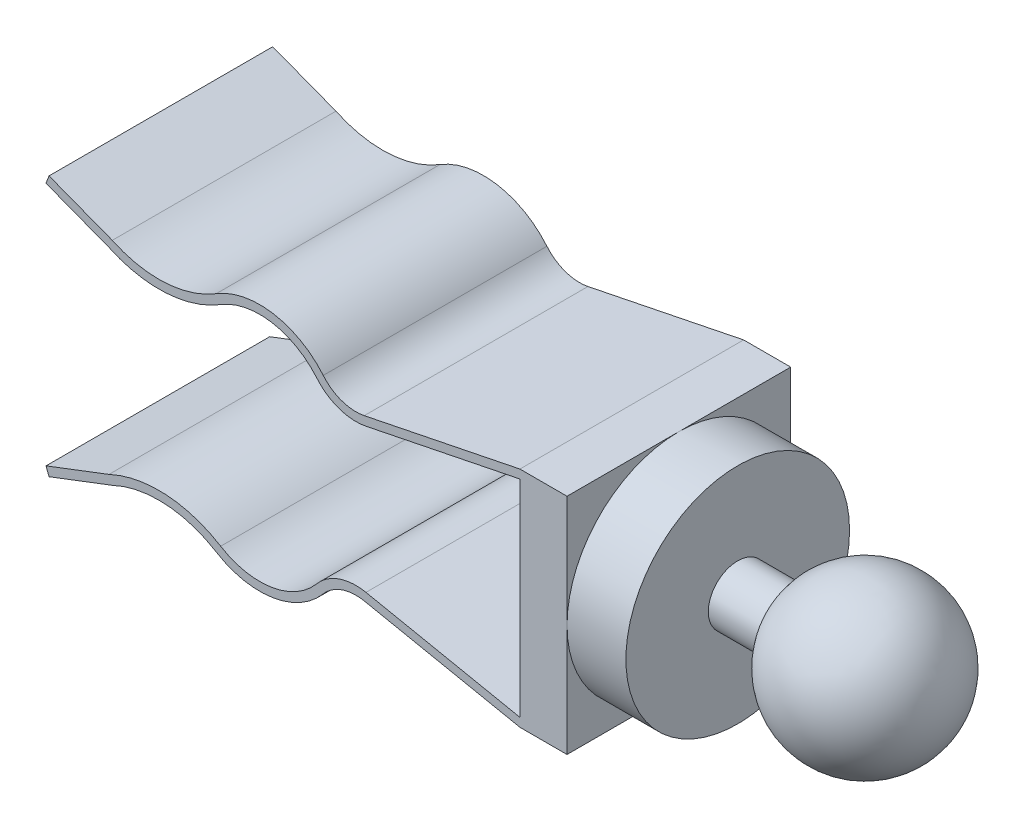
ISO-10303-21;
HEADER;
FILE_DESCRIPTION(('STEP AP214'),'2;1');
FILE_NAME('part.step','',(''),(''),'','','');
FILE_SCHEMA(('AUTOMOTIVE_DESIGN { 1 0 10303 214 1 1 1 1 }'));
ENDSEC;
DATA;
#1=APPLICATION_CONTEXT('core data for automotive mechanical design processes');
#2=APPLICATION_PROTOCOL_DEFINITION('international standard','automotive_design',2000,#1);
#3=PRODUCT_CONTEXT('',#1,'mechanical');
#4=PRODUCT('Part','Part','',(#3));
#5=PRODUCT_RELATED_PRODUCT_CATEGORY('part','',(#4));
#6=PRODUCT_DEFINITION_FORMATION('','',#4);
#7=PRODUCT_DEFINITION_CONTEXT('part definition',#1,'design');
#8=PRODUCT_DEFINITION('design','',#6,#7);
#9=PRODUCT_DEFINITION_SHAPE('','',#8);
#10=(LENGTH_UNIT() NAMED_UNIT(*) SI_UNIT(.MILLI.,.METRE.));
#11=(NAMED_UNIT(*) PLANE_ANGLE_UNIT() SI_UNIT($,.RADIAN.));
#12=(NAMED_UNIT(*) SI_UNIT($,.STERADIAN.) SOLID_ANGLE_UNIT());
#13=UNCERTAINTY_MEASURE_WITH_UNIT(LENGTH_MEASURE(1.E-05),#10,'distance_accuracy_value','');
#14=(GEOMETRIC_REPRESENTATION_CONTEXT(3) GLOBAL_UNCERTAINTY_ASSIGNED_CONTEXT((#13)) GLOBAL_UNIT_ASSIGNED_CONTEXT((#10,
#11,#12)) REPRESENTATION_CONTEXT('',''));
#15=CARTESIAN_POINT('',(0.,0.,0.));
#16=DIRECTION('',(0.,0.,1.));
#17=DIRECTION('',(1.,0.,0.));
#18=AXIS2_PLACEMENT_3D('',#15,#16,#17);
#19=CARTESIAN_POINT('',(-2.54,0.,0.));
#20=DIRECTION('',(1.,0.,0.));
#21=DIRECTION('',(0.,0.,-1.));
#22=AXIS2_PLACEMENT_3D('',#19,#20,#21);
#23=PLANE('',#22);
#24=DIRECTION('',(0.,0.,-1.));
#25=VECTOR('',#24,1.);
#26=CARTESIAN_POINT('',(-2.54,-5.56598333804343,0.));
#27=LINE('',#26,#25);
#28=CARTESIAN_POINT('',(-2.54,-5.56598333804343,6.0325));
#29=VERTEX_POINT('',#28);
#30=CARTESIAN_POINT('',(-2.54,-5.56598333804343,-6.0325));
#31=VERTEX_POINT('',#30);
#32=EDGE_CURVE('E56',#29,#31,#27,.T.);
#33=ORIENTED_EDGE('',*,*,#32,.F.);
#34=DIRECTION('',(0.,1.,0.));
#35=VECTOR('',#34,1.);
#36=CARTESIAN_POINT('',(-2.54,-6.0325,6.0325));
#37=LINE('',#36,#35);
#38=CARTESIAN_POINT('',(-2.54,5.56598333804342,6.0325));
#39=VERTEX_POINT('',#38);
#40=EDGE_CURVE('E355',#29,#39,#37,.T.);
#41=ORIENTED_EDGE('',*,*,#40,.T.);
#42=DIRECTION('',(0.,0.,1.));
#43=VECTOR('',#42,1.);
#44=CARTESIAN_POINT('',(-2.54,5.56598333804342,0.));
#45=LINE('',#44,#43);
#46=CARTESIAN_POINT('',(-2.54,5.56598333804342,-6.0325));
#47=VERTEX_POINT('',#46);
#48=EDGE_CURVE('E11',#47,#39,#45,.T.);
#49=ORIENTED_EDGE('',*,*,#48,.F.);
#50=DIRECTION('',(0.,-1.,0.));
#51=VECTOR('',#50,1.);
#52=CARTESIAN_POINT('',(-2.54,-6.0325,-6.0325));
#53=LINE('',#52,#51);
#54=EDGE_CURVE('E61',#47,#31,#53,.T.);
#55=ORIENTED_EDGE('',*,*,#54,.T.);
#56=EDGE_LOOP('',(#33,#41,#49,#55));
#57=FACE_BOUND('',#56,.T.);
#58=ADVANCED_FACE('F41',(#57),#23,.F.);
#59=CARTESIAN_POINT('',(6.35,0.,0.));
#60=DIRECTION('',(-1.,0.,0.));
#61=DIRECTION('',(0.,0.,1.));
#62=AXIS2_PLACEMENT_3D('',#59,#60,#61);
#63=CYLINDRICAL_SURFACE('',#62,1.5875);
#64=CARTESIAN_POINT('',(3.175,0.,0.));
#65=DIRECTION('',(1.,0.,0.));
#66=DIRECTION('',(0.,0.,-1.));
#67=AXIS2_PLACEMENT_3D('',#64,#65,#66);
#68=CIRCLE('',#67,1.5875);
#69=CARTESIAN_POINT('',(3.175,0.,-1.5875));
#70=VERTEX_POINT('',#69);
#71=EDGE_CURVE('E391',#70,#70,#68,.T.);
#72=ORIENTED_EDGE('',*,*,#71,.T.);
#73=EDGE_LOOP('',(#72));
#74=FACE_BOUND('',#73,.T.);
#75=CARTESIAN_POINT('',(6.01740941454436,0.,0.));
#76=DIRECTION('',(1.,0.,0.));
#77=DIRECTION('',(0.,0.,-1.));
#78=AXIS2_PLACEMENT_3D('',#75,#76,#77);
#79=CIRCLE('',#78,1.5875);
#80=CARTESIAN_POINT('',(6.01740941454436,0.,-1.5875));
#81=VERTEX_POINT('',#80);
#82=EDGE_CURVE('E49',#81,#81,#79,.T.);
#83=ORIENTED_EDGE('',*,*,#82,.F.);
#84=EDGE_LOOP('',(#83));
#85=FACE_BOUND('',#84,.T.);
#86=ADVANCED_FACE('F405',(#74,#85),#63,.T.);
#87=CARTESIAN_POINT('',(3.175,0.,0.));
#88=DIRECTION('',(-1.,0.,0.));
#89=DIRECTION('',(0.,0.,1.));
#90=AXIS2_PLACEMENT_3D('',#87,#88,#89);
#91=CYLINDRICAL_SURFACE('',#90,6.0325);
#92=CARTESIAN_POINT('',(3.175,0.,0.));
#93=DIRECTION('',(1.,0.,0.));
#94=DIRECTION('',(0.,0.,-1.));
#95=AXIS2_PLACEMENT_3D('',#92,#93,#94);
#96=CIRCLE('',#95,6.0325);
#97=CARTESIAN_POINT('',(3.175,0.,-6.0325));
#98=VERTEX_POINT('',#97);
#99=EDGE_CURVE('E394',#98,#98,#96,.T.);
#100=ORIENTED_EDGE('',*,*,#99,.F.);
#101=EDGE_LOOP('',(#100));
#102=FACE_BOUND('',#101,.T.);
#103=CARTESIAN_POINT('',(0.,0.,0.));
#104=DIRECTION('',(1.,0.,0.));
#105=DIRECTION('',(0.,0.,-1.));
#106=AXIS2_PLACEMENT_3D('',#103,#104,#105);
#107=CIRCLE('',#106,6.0325);
#108=CARTESIAN_POINT('',(0.,0.,-6.0325));
#109=VERTEX_POINT('',#108);
#110=CARTESIAN_POINT('',(0.,6.0325,0.));
#111=VERTEX_POINT('',#110);
#112=EDGE_CURVE('E397',#109,#111,#107,.T.);
#113=ORIENTED_EDGE('',*,*,#112,.T.);
#114=CARTESIAN_POINT('',(0.,0.,6.0325));
#115=VERTEX_POINT('',#114);
#116=EDGE_CURVE('E399',#111,#115,#107,.T.);
#117=ORIENTED_EDGE('',*,*,#116,.T.);
#118=CARTESIAN_POINT('',(0.,-6.0325,0.));
#119=VERTEX_POINT('',#118);
#120=EDGE_CURVE('E442',#115,#119,#107,.T.);
#121=ORIENTED_EDGE('',*,*,#120,.T.);
#122=EDGE_CURVE('E390',#119,#109,#107,.T.);
#123=ORIENTED_EDGE('',*,*,#122,.T.);
#124=EDGE_LOOP('',(#113,#117,#121,#123));
#125=FACE_BOUND('',#124,.T.);
#126=ADVANCED_FACE('F43',(#102,#125),#91,.T.);
#127=CARTESIAN_POINT('',(3.175,0.,0.));
#128=DIRECTION('',(1.,0.,0.));
#129=DIRECTION('',(0.,0.,-1.));
#130=AXIS2_PLACEMENT_3D('',#127,#128,#129);
#131=PLANE('',#130);
#132=ORIENTED_EDGE('',*,*,#71,.F.);
#133=EDGE_LOOP('',(#132));
#134=FACE_BOUND('',#133,.T.);
#135=ORIENTED_EDGE('',*,*,#99,.T.);
#136=EDGE_LOOP('',(#135));
#137=FACE_BOUND('',#136,.T.);
#138=ADVANCED_FACE('F413',(#134,#137),#131,.T.);
#139=CARTESIAN_POINT('',(10.033,0.,0.));
#140=DIRECTION('',(-1.,0.,0.));
#141=DIRECTION('',(0.,1.,0.));
#142=AXIS2_PLACEMENT_3D('',#139,#140,#141);
#143=SPHERICAL_SURFACE('',#142,4.318);
#144=ORIENTED_EDGE('',*,*,#82,.T.);
#145=EDGE_LOOP('',(#144));
#146=FACE_BOUND('',#145,.T.);
#147=ADVANCED_FACE('F403',(#146),#143,.T.);
#148=CARTESIAN_POINT('',(0.,0.,0.));
#149=DIRECTION('',(1.,0.,0.));
#150=DIRECTION('',(0.,0.,-1.));
#151=AXIS2_PLACEMENT_3D('',#148,#149,#150);
#152=PLANE('',#151);
#153=ORIENTED_EDGE('',*,*,#112,.F.);
#154=DIRECTION('',(0.,-1.,0.));
#155=VECTOR('',#154,1.);
#156=CARTESIAN_POINT('',(0.,-6.0325,-6.0325));
#157=LINE('',#156,#155);
#158=CARTESIAN_POINT('',(0.,6.0325,-6.0325));
#159=VERTEX_POINT('',#158);
#160=EDGE_CURVE('E374',#159,#109,#157,.T.);
#161=ORIENTED_EDGE('',*,*,#160,.F.);
#162=DIRECTION('',(0.,0.,-1.));
#163=VECTOR('',#162,1.);
#164=CARTESIAN_POINT('',(0.,6.0325,-6.0325));
#165=LINE('',#164,#163);
#166=EDGE_CURVE('E369',#111,#159,#165,.T.);
#167=ORIENTED_EDGE('',*,*,#166,.F.);
#168=EDGE_LOOP('',(#153,#161,#167));
#169=FACE_BOUND('',#168,.T.);
#170=ADVANCED_FACE('F423',(#169),#152,.T.);
#171=ORIENTED_EDGE('',*,*,#116,.F.);
#172=CARTESIAN_POINT('',(0.,6.0325,6.0325));
#173=VERTEX_POINT('',#172);
#174=EDGE_CURVE('E370',#173,#111,#165,.T.);
#175=ORIENTED_EDGE('',*,*,#174,.F.);
#176=DIRECTION('',(0.,1.,0.));
#177=VECTOR('',#176,1.);
#178=CARTESIAN_POINT('',(0.,-6.0325,6.0325));
#179=LINE('',#178,#177);
#180=EDGE_CURVE('E354',#115,#173,#179,.T.);
#181=ORIENTED_EDGE('',*,*,#180,.F.);
#182=EDGE_LOOP('',(#171,#175,#181));
#183=FACE_BOUND('',#182,.T.);
#184=ADVANCED_FACE('F441',(#183),#152,.T.);
#185=ORIENTED_EDGE('',*,*,#120,.F.);
#186=CARTESIAN_POINT('',(0.,-6.0325,6.0325));
#187=VERTEX_POINT('',#186);
#188=EDGE_CURVE('E366',#187,#115,#179,.T.);
#189=ORIENTED_EDGE('',*,*,#188,.F.);
#190=DIRECTION('',(0.,0.,1.));
#191=VECTOR('',#190,1.);
#192=CARTESIAN_POINT('',(0.,-6.0325,-6.0325));
#193=LINE('',#192,#191);
#194=EDGE_CURVE('E376',#119,#187,#193,.T.);
#195=ORIENTED_EDGE('',*,*,#194,.F.);
#196=EDGE_LOOP('',(#185,#189,#195));
#197=FACE_BOUND('',#196,.T.);
#198=ADVANCED_FACE('F446',(#197),#152,.T.);
#199=ORIENTED_EDGE('',*,*,#122,.F.);
#200=CARTESIAN_POINT('',(0.,-6.0325,-6.0325));
#201=VERTEX_POINT('',#200);
#202=EDGE_CURVE('E358',#201,#119,#193,.T.);
#203=ORIENTED_EDGE('',*,*,#202,.F.);
#204=EDGE_CURVE('E373',#109,#201,#157,.T.);
#205=ORIENTED_EDGE('',*,*,#204,.F.);
#206=EDGE_LOOP('',(#199,#203,#205));
#207=FACE_BOUND('',#206,.T.);
#208=ADVANCED_FACE('F453',(#207),#152,.T.);
#209=CARTESIAN_POINT('',(-2.54,-6.0325,6.0325));
#210=DIRECTION('',(0.,0.,-1.));
#211=DIRECTION('',(-1.,0.,0.));
#212=AXIS2_PLACEMENT_3D('',#209,#210,#211);
#213=PLANE('',#212);
#214=ORIENTED_EDGE('',*,*,#40,.F.);
#215=DIRECTION('',(-0.980029305025239,0.198853114865587,0.));
#216=VECTOR('',#215,1.);
#217=CARTESIAN_POINT('',(-2.44908435588346,-5.58443060174246,6.0325));
#218=LINE('',#217,#216);
#219=CARTESIAN_POINT('',(-10.8446585646915,-3.88092431479151,6.0325));
#220=VERTEX_POINT('',#219);
#221=EDGE_CURVE('E271',#29,#220,#218,.T.);
#222=ORIENTED_EDGE('',*,*,#221,.T.);
#223=CARTESIAN_POINT('',(-11.3918993320776,-6.57795015371483,6.0325));
#224=DIRECTION('',(0.,0.,1.));
#225=DIRECTION('',(1.,0.,0.));
#226=AXIS2_PLACEMENT_3D('',#223,#224,#225);
#227=CIRCLE('',#226,2.75198488973129);
#228=CARTESIAN_POINT('',(-13.4991677491617,-4.80796691885944,6.0325));
#229=VERTEX_POINT('',#228);
#230=EDGE_CURVE('E269',#220,#229,#227,.T.);
#231=ORIENTED_EDGE('',*,*,#230,.T.);
#232=CARTESIAN_POINT('',(-16.5742711152461,-2.22505846766734,6.0325));
#233=DIRECTION('',(0.,0.,-1.));
#234=DIRECTION('',(-1.,0.,0.));
#235=AXIS2_PLACEMENT_3D('',#232,#233,#234);
#236=CIRCLE('',#235,4.01592788522693);
#237=CARTESIAN_POINT('',(-18.6821202253877,-5.64334004006868,6.0325));
#238=VERTEX_POINT('',#237);
#239=EDGE_CURVE('E267',#229,#238,#236,.T.);
#240=ORIENTED_EDGE('',*,*,#239,.T.);
#241=CARTESIAN_POINT('',(-22.0107881147695,-11.0414133898986,6.0325));
#242=DIRECTION('',(0.,0.,1.));
#243=DIRECTION('',(1.,0.,0.));
#244=AXIS2_PLACEMENT_3D('',#241,#242,#243);
#245=CIRCLE('',#244,6.34186296035677);
#246=CARTESIAN_POINT('',(-24.708214463876,-5.30180391719998,6.0325));
#247=VERTEX_POINT('',#246);
#248=EDGE_CURVE('E265',#238,#247,#245,.T.);
#249=ORIENTED_EDGE('',*,*,#248,.T.);
#250=DIRECTION('',(-0.934036052877927,-0.357178739462782,0.));
#251=VECTOR('',#250,1.);
#252=CARTESIAN_POINT('',(-24.708214463876,-5.30180391719998,6.0325));
#253=LINE('',#252,#251);
#254=CARTESIAN_POINT('',(-28.1033021196824,-6.60009762388312,6.0325));
#255=VERTEX_POINT('',#254);
#256=EDGE_CURVE('E263',#247,#255,#253,.T.);
#257=ORIENTED_EDGE('',*,*,#256,.T.);
#258=DIRECTION('',(0.357178739462779,-0.934036052877928,0.));
#259=VECTOR('',#258,1.);
#260=CARTESIAN_POINT('',(-28.1033021196824,-6.60009762388312,6.0325));
#261=LINE('',#260,#259);
#262=CARTESIAN_POINT('',(-27.94,-7.02713890725891,6.0325));
#263=VERTEX_POINT('',#262);
#264=EDGE_CURVE('E261',#255,#263,#261,.T.);
#265=ORIENTED_EDGE('',*,*,#264,.T.);
#266=DIRECTION('',(0.934036052877927,0.357178739462782,0.));
#267=VECTOR('',#266,1.);
#268=CARTESIAN_POINT('',(-24.5287893249153,-5.72267970012807,6.0325));
#269=LINE('',#268,#267);
#270=CARTESIAN_POINT('',(-24.5287893249153,-5.72267970012807,6.0325));
#271=VERTEX_POINT('',#270);
#272=EDGE_CURVE('E259',#263,#271,#269,.T.);
#273=ORIENTED_EDGE('',*,*,#272,.T.);
#274=CARTESIAN_POINT('',(-22.0107881147695,-11.0414133898986,6.0325));
#275=DIRECTION('',(0.,0.,-1.));
#276=DIRECTION('',(1.,0.,0.));
#277=AXIS2_PLACEMENT_3D('',#274,#275,#276);
#278=CIRCLE('',#277,5.88466296035677);
#279=CARTESIAN_POINT('',(-18.922091818678,-6.03249999999998,6.0325));
#280=VERTEX_POINT('',#279);
#281=EDGE_CURVE('E245',#271,#280,#278,.T.);
#282=ORIENTED_EDGE('',*,*,#281,.T.);
#283=CARTESIAN_POINT('',(-16.5742711152461,-2.22505846766734,6.0325));
#284=DIRECTION('',(0.,0.,1.));
#285=DIRECTION('',(-1.,0.,0.));
#286=AXIS2_PLACEMENT_3D('',#283,#284,#285);
#287=CIRCLE('',#286,4.47312788522693);
#288=CARTESIAN_POINT('',(-13.1490774838097,-5.102022434206,6.0325));
#289=VERTEX_POINT('',#288);
#290=EDGE_CURVE('E237',#280,#289,#287,.T.);
#291=ORIENTED_EDGE('',*,*,#290,.T.);
#292=CARTESIAN_POINT('',(-11.3918993320776,-6.57795015371483,6.0325));
#293=DIRECTION('',(0.,0.,-1.));
#294=DIRECTION('',(1.,0.,0.));
#295=AXIS2_PLACEMENT_3D('',#292,#293,#294);
#296=CIRCLE('',#295,2.29478488973129);
#297=CARTESIAN_POINT('',(-10.9355742088081,-4.32899371304905,6.0325));
#298=VERTEX_POINT('',#297);
#299=EDGE_CURVE('E276',#289,#298,#296,.T.);
#300=ORIENTED_EDGE('',*,*,#299,.T.);
#301=DIRECTION('',(0.980029305025239,-0.198853114865587,0.));
#302=VECTOR('',#301,1.);
#303=CARTESIAN_POINT('',(-2.54000000000001,-6.0325,6.0325));
#304=LINE('',#303,#302);
#305=CARTESIAN_POINT('',(-2.54000000000001,-6.0325,6.0325));
#306=VERTEX_POINT('',#305);
#307=EDGE_CURVE('E273',#298,#306,#304,.T.);
#308=ORIENTED_EDGE('',*,*,#307,.T.);
#309=DIRECTION('',(1.,0.,0.));
#310=VECTOR('',#309,1.);
#311=CARTESIAN_POINT('',(-2.54,-6.0325,6.0325));
#312=LINE('',#311,#310);
#313=EDGE_CURVE('E365',#306,#187,#312,.T.);
#314=ORIENTED_EDGE('',*,*,#313,.T.);
#315=ORIENTED_EDGE('',*,*,#188,.T.);
#316=ORIENTED_EDGE('',*,*,#180,.T.);
#317=DIRECTION('',(1.,0.,0.));
#318=VECTOR('',#317,1.);
#319=CARTESIAN_POINT('',(-2.54,6.0325,6.0325));
#320=LINE('',#319,#318);
#321=CARTESIAN_POINT('',(-2.54,6.0325,6.0325));
#322=VERTEX_POINT('',#321);
#323=EDGE_CURVE('E387',#322,#173,#320,.T.);
#324=ORIENTED_EDGE('',*,*,#323,.F.);
#325=DIRECTION('',(-0.98002930502524,-0.198853114865585,0.));
#326=VECTOR('',#325,1.);
#327=CARTESIAN_POINT('',(-2.54,6.0325,6.0325));
#328=LINE('',#327,#326);
#329=CARTESIAN_POINT('',(-10.935574208808,4.32899371304906,6.0325));
#330=VERTEX_POINT('',#329);
#331=EDGE_CURVE('E279',#322,#330,#328,.T.);
#332=ORIENTED_EDGE('',*,*,#331,.T.);
#333=CARTESIAN_POINT('',(-11.3918993320776,6.57795015371484,6.0325));
#334=DIRECTION('',(0.,0.,-1.));
#335=DIRECTION('',(-1.,0.,0.));
#336=AXIS2_PLACEMENT_3D('',#333,#334,#335);
#337=CIRCLE('',#336,2.29478488973129);
#338=CARTESIAN_POINT('',(-13.1490774838097,5.10202243420602,6.0325));
#339=VERTEX_POINT('',#338);
#340=EDGE_CURVE('E281',#330,#339,#337,.T.);
#341=ORIENTED_EDGE('',*,*,#340,.T.);
#342=CARTESIAN_POINT('',(-16.5742711152461,2.22505846766736,6.0325));
#343=DIRECTION('',(0.,0.,1.));
#344=DIRECTION('',(1.,0.,0.));
#345=AXIS2_PLACEMENT_3D('',#342,#343,#344);
#346=CIRCLE('',#345,4.47312788522693);
#347=CARTESIAN_POINT('',(-18.922091818678,6.0325,6.0325));
#348=VERTEX_POINT('',#347);
#349=EDGE_CURVE('E284',#339,#348,#346,.T.);
#350=ORIENTED_EDGE('',*,*,#349,.T.);
#351=CARTESIAN_POINT('',(-22.0107881147695,11.0414133898986,6.0325));
#352=DIRECTION('',(0.,0.,-1.));
#353=DIRECTION('',(-1.,0.,0.));
#354=AXIS2_PLACEMENT_3D('',#351,#352,#353);
#355=CIRCLE('',#354,5.88466296035677);
#356=CARTESIAN_POINT('',(-24.5287893249152,5.7226797001281,6.0325));
#357=VERTEX_POINT('',#356);
#358=EDGE_CURVE('E286',#348,#357,#355,.T.);
#359=ORIENTED_EDGE('',*,*,#358,.T.);
#360=DIRECTION('',(-0.934036052877926,0.357178739462784,0.));
#361=VECTOR('',#360,1.);
#362=CARTESIAN_POINT('',(-24.5287893249152,5.7226797001281,6.0325));
#363=LINE('',#362,#361);
#364=CARTESIAN_POINT('',(-27.94,7.02713890725895,6.0325));
#365=VERTEX_POINT('',#364);
#366=EDGE_CURVE('E288',#357,#365,#363,.T.);
#367=ORIENTED_EDGE('',*,*,#366,.T.);
#368=DIRECTION('',(-0.357178739462787,-0.934036052877925,0.));
#369=VECTOR('',#368,1.);
#370=CARTESIAN_POINT('',(-27.94,7.02713890725895,6.0325));
#371=LINE('',#370,#369);
#372=CARTESIAN_POINT('',(-28.1033021196824,6.60009762388316,6.0325));
#373=VERTEX_POINT('',#372);
#374=EDGE_CURVE('E290',#365,#373,#371,.T.);
#375=ORIENTED_EDGE('',*,*,#374,.T.);
#376=DIRECTION('',(0.934036052877926,-0.357178739462784,0.));
#377=VECTOR('',#376,1.);
#378=CARTESIAN_POINT('',(-24.7082144638759,5.30180391719997,6.0325));
#379=LINE('',#378,#377);
#380=CARTESIAN_POINT('',(-24.7082144638759,5.30180391719997,6.0325));
#381=VERTEX_POINT('',#380);
#382=EDGE_CURVE('E292',#373,#381,#379,.T.);
#383=ORIENTED_EDGE('',*,*,#382,.T.);
#384=CARTESIAN_POINT('',(-22.0107881147695,11.0414133898986,6.0325));
#385=DIRECTION('',(0.,0.,1.));
#386=DIRECTION('',(-1.,0.,0.));
#387=AXIS2_PLACEMENT_3D('',#384,#385,#386);
#388=CIRCLE('',#387,6.34186296035677);
#389=CARTESIAN_POINT('',(-18.6821202253877,5.64334004006871,6.0325));
#390=VERTEX_POINT('',#389);
#391=EDGE_CURVE('E294',#381,#390,#388,.T.);
#392=ORIENTED_EDGE('',*,*,#391,.T.);
#393=CARTESIAN_POINT('',(-16.5742711152461,2.22505846766736,6.0325));
#394=DIRECTION('',(0.,0.,-1.));
#395=DIRECTION('',(1.,0.,0.));
#396=AXIS2_PLACEMENT_3D('',#393,#394,#395);
#397=CIRCLE('',#396,4.01592788522693);
#398=CARTESIAN_POINT('',(-13.4991677491617,4.80796691885946,6.0325));
#399=VERTEX_POINT('',#398);
#400=EDGE_CURVE('E296',#390,#399,#397,.T.);
#401=ORIENTED_EDGE('',*,*,#400,.T.);
#402=CARTESIAN_POINT('',(-11.3918993320776,6.57795015371484,6.0325));
#403=DIRECTION('',(0.,0.,1.));
#404=DIRECTION('',(-1.,0.,0.));
#405=AXIS2_PLACEMENT_3D('',#402,#403,#404);
#406=CIRCLE('',#405,2.75198488973129);
#407=CARTESIAN_POINT('',(-10.8446585646915,3.88092431479152,6.0325));
#408=VERTEX_POINT('',#407);
#409=EDGE_CURVE('E298',#399,#408,#406,.T.);
#410=ORIENTED_EDGE('',*,*,#409,.T.);
#411=DIRECTION('',(0.98002930502524,0.198853114865585,0.));
#412=VECTOR('',#411,1.);
#413=CARTESIAN_POINT('',(-2.44908435588345,5.58443060174246,6.0325));
#414=LINE('',#413,#412);
#415=EDGE_CURVE('E300',#408,#39,#414,.T.);
#416=ORIENTED_EDGE('',*,*,#415,.T.);
#417=EDGE_LOOP('',(#214,#222,#231,#240,#249,#257,#265,#273,#282,#291,#300,#308,#314,#315,#316,
#324,#332,#341,#350,#359,#367,#375,#383,#392,#401,#410,#416));
#418=FACE_BOUND('',#417,.T.);
#419=ADVANCED_FACE('F459',(#418),#213,.F.);
#420=CARTESIAN_POINT('',(-2.54,6.0325,-6.0325));
#421=DIRECTION('',(0.,-1.,0.));
#422=DIRECTION('',(0.,0.,-1.));
#423=AXIS2_PLACEMENT_3D('',#420,#421,#422);
#424=PLANE('',#423);
#425=ORIENTED_EDGE('',*,*,#174,.T.);
#426=ORIENTED_EDGE('',*,*,#166,.T.);
#427=DIRECTION('',(1.,0.,0.));
#428=VECTOR('',#427,1.);
#429=CARTESIAN_POINT('',(-2.54,6.0325,-6.0325));
#430=LINE('',#429,#428);
#431=CARTESIAN_POINT('',(-2.54,6.0325,-6.0325));
#432=VERTEX_POINT('',#431);
#433=EDGE_CURVE('E384',#432,#159,#430,.T.);
#434=ORIENTED_EDGE('',*,*,#433,.F.);
#435=DIRECTION('',(0.,0.,-1.));
#436=VECTOR('',#435,1.);
#437=CARTESIAN_POINT('',(-2.54,6.0325,-6.0325));
#438=LINE('',#437,#436);
#439=EDGE_CURVE('E357',#322,#432,#438,.T.);
#440=ORIENTED_EDGE('',*,*,#439,.F.);
#441=ORIENTED_EDGE('',*,*,#323,.T.);
#442=EDGE_LOOP('',(#425,#426,#434,#440,#441));
#443=FACE_BOUND('',#442,.T.);
#444=ADVANCED_FACE('F437',(#443),#424,.F.);
#445=CARTESIAN_POINT('',(-2.54,-6.0325,-6.0325));
#446=DIRECTION('',(0.,0.,1.));
#447=DIRECTION('',(1.,0.,0.));
#448=AXIS2_PLACEMENT_3D('',#445,#446,#447);
#449=PLANE('',#448);
#450=DIRECTION('',(1.,0.,0.));
#451=VECTOR('',#450,1.);
#452=CARTESIAN_POINT('',(-2.54,-6.0325,-6.0325));
#453=LINE('',#452,#451);
#454=CARTESIAN_POINT('',(-2.54,-6.0325,-6.0325));
#455=VERTEX_POINT('',#454);
#456=EDGE_CURVE('E381',#455,#201,#453,.T.);
#457=ORIENTED_EDGE('',*,*,#456,.F.);
#458=DIRECTION('',(0.980029305025239,-0.198853114865587,0.));
#459=VECTOR('',#458,1.);
#460=CARTESIAN_POINT('',(-2.54000000000001,-6.0325,-6.0325));
#461=LINE('',#460,#459);
#462=CARTESIAN_POINT('',(-10.9355742088081,-4.32899371304905,-6.0325));
#463=VERTEX_POINT('',#462);
#464=EDGE_CURVE('E254',#463,#455,#461,.T.);
#465=ORIENTED_EDGE('',*,*,#464,.F.);
#466=CARTESIAN_POINT('',(-11.3918993320776,-6.57795015371483,-6.0325));
#467=DIRECTION('',(0.,0.,-1.));
#468=DIRECTION('',(1.,0.,0.));
#469=AXIS2_PLACEMENT_3D('',#466,#467,#468);
#470=CIRCLE('',#469,2.29478488973129);
#471=CARTESIAN_POINT('',(-13.1490774838097,-5.102022434206,-6.0325));
#472=VERTEX_POINT('',#471);
#473=EDGE_CURVE('E249',#472,#463,#470,.T.);
#474=ORIENTED_EDGE('',*,*,#473,.F.);
#475=CARTESIAN_POINT('',(-16.5742711152461,-2.22505846766734,-6.0325));
#476=DIRECTION('',(0.,0.,1.));
#477=DIRECTION('',(-1.,0.,0.));
#478=AXIS2_PLACEMENT_3D('',#475,#476,#477);
#479=CIRCLE('',#478,4.47312788522693);
#480=CARTESIAN_POINT('',(-18.922091818678,-6.03249999999998,-6.0325));
#481=VERTEX_POINT('',#480);
#482=EDGE_CURVE('E243',#481,#472,#479,.T.);
#483=ORIENTED_EDGE('',*,*,#482,.F.);
#484=CARTESIAN_POINT('',(-22.0107881147695,-11.0414133898986,-6.0325));
#485=DIRECTION('',(0.,0.,-1.));
#486=DIRECTION('',(1.,0.,0.));
#487=AXIS2_PLACEMENT_3D('',#484,#485,#486);
#488=CIRCLE('',#487,5.88466296035677);
#489=CARTESIAN_POINT('',(-24.5287893249153,-5.72267970012807,-6.0325));
#490=VERTEX_POINT('',#489);
#491=EDGE_CURVE('E225',#490,#481,#488,.T.);
#492=ORIENTED_EDGE('',*,*,#491,.F.);
#493=DIRECTION('',(0.934036052877927,0.357178739462782,0.));
#494=VECTOR('',#493,1.);
#495=CARTESIAN_POINT('',(-24.5287893249153,-5.72267970012807,-6.0325));
#496=LINE('',#495,#494);
#497=CARTESIAN_POINT('',(-27.94,-7.02713890725891,-6.0325));
#498=VERTEX_POINT('',#497);
#499=EDGE_CURVE('E236',#498,#490,#496,.T.);
#500=ORIENTED_EDGE('',*,*,#499,.F.);
#501=DIRECTION('',(0.357178739462779,-0.934036052877928,0.));
#502=VECTOR('',#501,1.);
#503=CARTESIAN_POINT('',(-28.1033021196824,-6.60009762388312,-6.0325));
#504=LINE('',#503,#502);
#505=CARTESIAN_POINT('',(-28.1033021196824,-6.60009762388312,-6.0325));
#506=VERTEX_POINT('',#505);
#507=EDGE_CURVE('E560',#506,#498,#504,.T.);
#508=ORIENTED_EDGE('',*,*,#507,.F.);
#509=DIRECTION('',(-0.934036052877927,-0.357178739462782,0.));
#510=VECTOR('',#509,1.);
#511=CARTESIAN_POINT('',(-24.708214463876,-5.30180391719998,-6.0325));
#512=LINE('',#511,#510);
#513=CARTESIAN_POINT('',(-24.708214463876,-5.30180391719998,-6.0325));
#514=VERTEX_POINT('',#513);
#515=EDGE_CURVE('E576',#514,#506,#512,.T.);
#516=ORIENTED_EDGE('',*,*,#515,.F.);
#517=CARTESIAN_POINT('',(-22.0107881147695,-11.0414133898986,-6.0325));
#518=DIRECTION('',(0.,0.,1.));
#519=DIRECTION('',(1.,0.,0.));
#520=AXIS2_PLACEMENT_3D('',#517,#518,#519);
#521=CIRCLE('',#520,6.34186296035677);
#522=CARTESIAN_POINT('',(-18.6821202253877,-5.64334004006868,-6.0325));
#523=VERTEX_POINT('',#522);
#524=EDGE_CURVE('E544',#523,#514,#521,.T.);
#525=ORIENTED_EDGE('',*,*,#524,.F.);
#526=CARTESIAN_POINT('',(-16.5742711152461,-2.22505846766734,-6.0325));
#527=DIRECTION('',(0.,0.,-1.));
#528=DIRECTION('',(-1.,0.,0.));
#529=AXIS2_PLACEMENT_3D('',#526,#527,#528);
#530=CIRCLE('',#529,4.01592788522693);
#531=CARTESIAN_POINT('',(-13.4991677491617,-4.80796691885944,-6.0325));
#532=VERTEX_POINT('',#531);
#533=EDGE_CURVE('E536',#532,#523,#530,.T.);
#534=ORIENTED_EDGE('',*,*,#533,.F.);
#535=CARTESIAN_POINT('',(-11.3918993320776,-6.57795015371483,-6.0325));
#536=DIRECTION('',(0.,0.,1.));
#537=DIRECTION('',(1.,0.,0.));
#538=AXIS2_PLACEMENT_3D('',#535,#536,#537);
#539=CIRCLE('',#538,2.75198488973129);
#540=CARTESIAN_POINT('',(-10.8446585646915,-3.88092431479151,-6.0325));
#541=VERTEX_POINT('',#540);
#542=EDGE_CURVE('E580',#541,#532,#539,.T.);
#543=ORIENTED_EDGE('',*,*,#542,.F.);
#544=DIRECTION('',(-0.980029305025239,0.198853114865587,0.));
#545=VECTOR('',#544,1.);
#546=CARTESIAN_POINT('',(-2.44908435588346,-5.58443060174246,-6.0325));
#547=LINE('',#546,#545);
#548=EDGE_CURVE('E518',#31,#541,#547,.T.);
#549=ORIENTED_EDGE('',*,*,#548,.F.);
#550=ORIENTED_EDGE('',*,*,#54,.F.);
#551=DIRECTION('',(0.98002930502524,0.198853114865585,0.));
#552=VECTOR('',#551,1.);
#553=CARTESIAN_POINT('',(-2.44908435588345,5.58443060174246,-6.0325));
#554=LINE('',#553,#552);
#555=CARTESIAN_POINT('',(-10.8446585646915,3.88092431479152,-6.0325));
#556=VERTEX_POINT('',#555);
#557=EDGE_CURVE('E282',#556,#47,#554,.T.);
#558=ORIENTED_EDGE('',*,*,#557,.F.);
#559=CARTESIAN_POINT('',(-11.3918993320776,6.57795015371484,-6.0325));
#560=DIRECTION('',(0.,0.,1.));
#561=DIRECTION('',(-1.,0.,0.));
#562=AXIS2_PLACEMENT_3D('',#559,#560,#561);
#563=CIRCLE('',#562,2.75198488973129);
#564=CARTESIAN_POINT('',(-13.4991677491617,4.80796691885946,-6.0325));
#565=VERTEX_POINT('',#564);
#566=EDGE_CURVE('E321',#565,#556,#563,.T.);
#567=ORIENTED_EDGE('',*,*,#566,.F.);
#568=CARTESIAN_POINT('',(-16.5742711152461,2.22505846766736,-6.0325));
#569=DIRECTION('',(0.,0.,-1.));
#570=DIRECTION('',(1.,0.,0.));
#571=AXIS2_PLACEMENT_3D('',#568,#569,#570);
#572=CIRCLE('',#571,4.01592788522693);
#573=CARTESIAN_POINT('',(-18.6821202253877,5.64334004006871,-6.0325));
#574=VERTEX_POINT('',#573);
#575=EDGE_CURVE('E319',#574,#565,#572,.T.);
#576=ORIENTED_EDGE('',*,*,#575,.F.);
#577=CARTESIAN_POINT('',(-22.0107881147695,11.0414133898986,-6.0325));
#578=DIRECTION('',(0.,0.,1.));
#579=DIRECTION('',(-1.,0.,0.));
#580=AXIS2_PLACEMENT_3D('',#577,#578,#579);
#581=CIRCLE('',#580,6.34186296035677);
#582=CARTESIAN_POINT('',(-24.7082144638759,5.30180391719997,-6.0325));
#583=VERTEX_POINT('',#582);
#584=EDGE_CURVE('E317',#583,#574,#581,.T.);
#585=ORIENTED_EDGE('',*,*,#584,.F.);
#586=DIRECTION('',(0.934036052877926,-0.357178739462784,0.));
#587=VECTOR('',#586,1.);
#588=CARTESIAN_POINT('',(-24.7082144638759,5.30180391719997,-6.0325));
#589=LINE('',#588,#587);
#590=CARTESIAN_POINT('',(-28.1033021196824,6.60009762388316,-6.0325));
#591=VERTEX_POINT('',#590);
#592=EDGE_CURVE('E315',#591,#583,#589,.T.);
#593=ORIENTED_EDGE('',*,*,#592,.F.);
#594=DIRECTION('',(-0.357178739462787,-0.934036052877925,0.));
#595=VECTOR('',#594,1.);
#596=CARTESIAN_POINT('',(-27.94,7.02713890725895,-6.0325));
#597=LINE('',#596,#595);
#598=CARTESIAN_POINT('',(-27.94,7.02713890725895,-6.0325));
#599=VERTEX_POINT('',#598);
#600=EDGE_CURVE('E313',#599,#591,#597,.T.);
#601=ORIENTED_EDGE('',*,*,#600,.F.);
#602=DIRECTION('',(-0.934036052877926,0.357178739462784,0.));
#603=VECTOR('',#602,1.);
#604=CARTESIAN_POINT('',(-24.5287893249152,5.7226797001281,-6.0325));
#605=LINE('',#604,#603);
#606=CARTESIAN_POINT('',(-24.5287893249152,5.7226797001281,-6.0325));
#607=VERTEX_POINT('',#606);
#608=EDGE_CURVE('E311',#607,#599,#605,.T.);
#609=ORIENTED_EDGE('',*,*,#608,.F.);
#610=CARTESIAN_POINT('',(-22.0107881147695,11.0414133898986,-6.0325));
#611=DIRECTION('',(0.,0.,-1.));
#612=DIRECTION('',(-1.,0.,0.));
#613=AXIS2_PLACEMENT_3D('',#610,#611,#612);
#614=CIRCLE('',#613,5.88466296035677);
#615=CARTESIAN_POINT('',(-18.922091818678,6.0325,-6.0325));
#616=VERTEX_POINT('',#615);
#617=EDGE_CURVE('E309',#616,#607,#614,.T.);
#618=ORIENTED_EDGE('',*,*,#617,.F.);
#619=CARTESIAN_POINT('',(-16.5742711152461,2.22505846766736,-6.0325));
#620=DIRECTION('',(0.,0.,1.));
#621=DIRECTION('',(1.,0.,0.));
#622=AXIS2_PLACEMENT_3D('',#619,#620,#621);
#623=CIRCLE('',#622,4.47312788522693);
#624=CARTESIAN_POINT('',(-13.1490774838097,5.10202243420602,-6.0325));
#625=VERTEX_POINT('',#624);
#626=EDGE_CURVE('E307',#625,#616,#623,.T.);
#627=ORIENTED_EDGE('',*,*,#626,.F.);
#628=CARTESIAN_POINT('',(-11.3918993320776,6.57795015371484,-6.0325));
#629=DIRECTION('',(0.,0.,-1.));
#630=DIRECTION('',(-1.,0.,0.));
#631=AXIS2_PLACEMENT_3D('',#628,#629,#630);
#632=CIRCLE('',#631,2.29478488973129);
#633=CARTESIAN_POINT('',(-10.935574208808,4.32899371304906,-6.0325));
#634=VERTEX_POINT('',#633);
#635=EDGE_CURVE('E305',#634,#625,#632,.T.);
#636=ORIENTED_EDGE('',*,*,#635,.F.);
#637=DIRECTION('',(-0.98002930502524,-0.198853114865585,0.));
#638=VECTOR('',#637,1.);
#639=CARTESIAN_POINT('',(-2.54,6.0325,-6.0325));
#640=LINE('',#639,#638);
#641=EDGE_CURVE('E252',#432,#634,#640,.T.);
#642=ORIENTED_EDGE('',*,*,#641,.F.);
#643=ORIENTED_EDGE('',*,*,#433,.T.);
#644=ORIENTED_EDGE('',*,*,#160,.T.);
#645=ORIENTED_EDGE('',*,*,#204,.T.);
#646=EDGE_LOOP('',(#457,#465,#474,#483,#492,#500,#508,#516,#525,#534,#543,#549,#550,#558,#567,
#576,#585,#593,#601,#609,#618,#627,#636,#642,#643,#644,#645));
#647=FACE_BOUND('',#646,.T.);
#648=ADVANCED_FACE('F247',(#647),#449,.F.);
#649=CARTESIAN_POINT('',(-2.54,-6.0325,-6.0325));
#650=DIRECTION('',(0.,1.,0.));
#651=DIRECTION('',(0.,0.,1.));
#652=AXIS2_PLACEMENT_3D('',#649,#650,#651);
#653=PLANE('',#652);
#654=ORIENTED_EDGE('',*,*,#202,.T.);
#655=ORIENTED_EDGE('',*,*,#194,.T.);
#656=ORIENTED_EDGE('',*,*,#313,.F.);
#657=DIRECTION('',(0.,0.,1.));
#658=VECTOR('',#657,1.);
#659=CARTESIAN_POINT('',(-2.54,-6.0325,-6.0325));
#660=LINE('',#659,#658);
#661=EDGE_CURVE('E362',#455,#306,#660,.T.);
#662=ORIENTED_EDGE('',*,*,#661,.F.);
#663=ORIENTED_EDGE('',*,*,#456,.T.);
#664=EDGE_LOOP('',(#654,#655,#656,#662,#663));
#665=FACE_BOUND('',#664,.T.);
#666=ADVANCED_FACE('F449',(#665),#653,.F.);
#667=CARTESIAN_POINT('',(-2.44908435588345,5.58443060174246,6.0325));
#668=DIRECTION('',(-0.198853114865585,0.98002930502524,0.));
#669=DIRECTION('',(-0.98002930502524,-0.198853114865585,0.));
#670=AXIS2_PLACEMENT_3D('',#667,#668,#669);
#671=PLANE('',#670);
#672=ORIENTED_EDGE('',*,*,#557,.T.);
#673=ORIENTED_EDGE('',*,*,#48,.T.);
#674=ORIENTED_EDGE('',*,*,#415,.F.);
#675=DIRECTION('',(0.,0.,-1.));
#676=VECTOR('',#675,1.);
#677=CARTESIAN_POINT('',(-10.8446585646915,3.88092431479152,6.0325));
#678=LINE('',#677,#676);
#679=EDGE_CURVE('E303',#408,#556,#678,.T.);
#680=ORIENTED_EDGE('',*,*,#679,.T.);
#681=EDGE_LOOP('',(#672,#673,#674,#680));
#682=FACE_BOUND('',#681,.T.);
#683=ADVANCED_FACE('F509',(#682),#671,.F.);
#684=CARTESIAN_POINT('',(-2.54,6.0325,6.0325));
#685=DIRECTION('',(0.198853114865585,-0.98002930502524,0.));
#686=DIRECTION('',(0.98002930502524,0.198853114865585,0.));
#687=AXIS2_PLACEMENT_3D('',#684,#685,#686);
#688=PLANE('',#687);
#689=ORIENTED_EDGE('',*,*,#641,.T.);
#690=DIRECTION('',(0.,0.,-1.));
#691=VECTOR('',#690,1.);
#692=CARTESIAN_POINT('',(-10.935574208808,4.32899371304906,6.0325));
#693=LINE('',#692,#691);
#694=EDGE_CURVE('E351',#330,#634,#693,.T.);
#695=ORIENTED_EDGE('',*,*,#694,.F.);
#696=ORIENTED_EDGE('',*,*,#331,.F.);
#697=ORIENTED_EDGE('',*,*,#439,.T.);
#698=EDGE_LOOP('',(#689,#695,#696,#697));
#699=FACE_BOUND('',#698,.T.);
#700=ADVANCED_FACE('F461',(#699),#688,.F.);
#701=CARTESIAN_POINT('',(-11.3918993320776,6.57795015371484,6.0325));
#702=DIRECTION('',(0.,0.,-1.));
#703=DIRECTION('',(-1.,0.,0.));
#704=AXIS2_PLACEMENT_3D('',#701,#702,#703);
#705=CYLINDRICAL_SURFACE('',#704,2.29478488973129);
#706=ORIENTED_EDGE('',*,*,#635,.T.);
#707=DIRECTION('',(0.,0.,-1.));
#708=VECTOR('',#707,1.);
#709=CARTESIAN_POINT('',(-13.1490774838097,5.10202243420602,6.0325));
#710=LINE('',#709,#708);
#711=EDGE_CURVE('E348',#339,#625,#710,.T.);
#712=ORIENTED_EDGE('',*,*,#711,.F.);
#713=ORIENTED_EDGE('',*,*,#340,.F.);
#714=ORIENTED_EDGE('',*,*,#694,.T.);
#715=EDGE_LOOP('',(#706,#712,#713,#714));
#716=FACE_BOUND('',#715,.T.);
#717=ADVANCED_FACE('F465',(#716),#705,.F.);
#718=CARTESIAN_POINT('',(-16.5742711152461,2.22505846766736,6.0325));
#719=DIRECTION('',(0.,0.,-1.));
#720=DIRECTION('',(-1.,0.,0.));
#721=AXIS2_PLACEMENT_3D('',#718,#719,#720);
#722=CYLINDRICAL_SURFACE('',#721,4.47312788522693);
#723=ORIENTED_EDGE('',*,*,#626,.T.);
#724=DIRECTION('',(0.,0.,-1.));
#725=VECTOR('',#724,1.);
#726=CARTESIAN_POINT('',(-18.922091818678,6.0325,6.0325));
#727=LINE('',#726,#725);
#728=EDGE_CURVE('E345',#348,#616,#727,.T.);
#729=ORIENTED_EDGE('',*,*,#728,.F.);
#730=ORIENTED_EDGE('',*,*,#349,.F.);
#731=ORIENTED_EDGE('',*,*,#711,.T.);
#732=EDGE_LOOP('',(#723,#729,#730,#731));
#733=FACE_BOUND('',#732,.T.);
#734=ADVANCED_FACE('F471',(#733),#722,.T.);
#735=CARTESIAN_POINT('',(-22.0107881147695,11.0414133898986,6.0325));
#736=DIRECTION('',(0.,0.,-1.));
#737=DIRECTION('',(-1.,0.,0.));
#738=AXIS2_PLACEMENT_3D('',#735,#736,#737);
#739=CYLINDRICAL_SURFACE('',#738,5.88466296035677);
#740=ORIENTED_EDGE('',*,*,#617,.T.);
#741=DIRECTION('',(0.,0.,-1.));
#742=VECTOR('',#741,1.);
#743=CARTESIAN_POINT('',(-24.5287893249152,5.7226797001281,6.0325));
#744=LINE('',#743,#742);
#745=EDGE_CURVE('E342',#357,#607,#744,.T.);
#746=ORIENTED_EDGE('',*,*,#745,.F.);
#747=ORIENTED_EDGE('',*,*,#358,.F.);
#748=ORIENTED_EDGE('',*,*,#728,.T.);
#749=EDGE_LOOP('',(#740,#746,#747,#748));
#750=FACE_BOUND('',#749,.T.);
#751=ADVANCED_FACE('F475',(#750),#739,.F.);
#752=CARTESIAN_POINT('',(-24.5287893249152,5.7226797001281,6.0325));
#753=DIRECTION('',(-0.357178739462784,-0.934036052877926,0.));
#754=DIRECTION('',(0.934036052877926,-0.357178739462784,0.));
#755=AXIS2_PLACEMENT_3D('',#752,#753,#754);
#756=PLANE('',#755);
#757=ORIENTED_EDGE('',*,*,#608,.T.);
#758=DIRECTION('',(0.,0.,-1.));
#759=VECTOR('',#758,1.);
#760=CARTESIAN_POINT('',(-27.94,7.02713890725895,6.0325));
#761=LINE('',#760,#759);
#762=EDGE_CURVE('E339',#365,#599,#761,.T.);
#763=ORIENTED_EDGE('',*,*,#762,.F.);
#764=ORIENTED_EDGE('',*,*,#366,.F.);
#765=ORIENTED_EDGE('',*,*,#745,.T.);
#766=EDGE_LOOP('',(#757,#763,#764,#765));
#767=FACE_BOUND('',#766,.T.);
#768=ADVANCED_FACE('F480',(#767),#756,.F.);
#769=CARTESIAN_POINT('',(-27.94,7.02713890725895,6.0325));
#770=DIRECTION('',(0.934036052877925,-0.357178739462787,0.));
#771=DIRECTION('',(0.357178739462787,0.934036052877925,0.));
#772=AXIS2_PLACEMENT_3D('',#769,#770,#771);
#773=PLANE('',#772);
#774=ORIENTED_EDGE('',*,*,#600,.T.);
#775=DIRECTION('',(0.,0.,-1.));
#776=VECTOR('',#775,1.);
#777=CARTESIAN_POINT('',(-28.1033021196824,6.60009762388316,6.0325));
#778=LINE('',#777,#776);
#779=EDGE_CURVE('E336',#373,#591,#778,.T.);
#780=ORIENTED_EDGE('',*,*,#779,.F.);
#781=ORIENTED_EDGE('',*,*,#374,.F.);
#782=ORIENTED_EDGE('',*,*,#762,.T.);
#783=EDGE_LOOP('',(#774,#780,#781,#782));
#784=FACE_BOUND('',#783,.T.);
#785=ADVANCED_FACE('F486',(#784),#773,.F.);
#786=CARTESIAN_POINT('',(-24.7082144638759,5.30180391719997,6.0325));
#787=DIRECTION('',(0.357178739462784,0.934036052877926,0.));
#788=DIRECTION('',(-0.934036052877926,0.357178739462784,0.));
#789=AXIS2_PLACEMENT_3D('',#786,#787,#788);
#790=PLANE('',#789);
#791=ORIENTED_EDGE('',*,*,#592,.T.);
#792=DIRECTION('',(0.,0.,-1.));
#793=VECTOR('',#792,1.);
#794=CARTESIAN_POINT('',(-24.7082144638759,5.30180391719997,6.0325));
#795=LINE('',#794,#793);
#796=EDGE_CURVE('E333',#381,#583,#795,.T.);
#797=ORIENTED_EDGE('',*,*,#796,.F.);
#798=ORIENTED_EDGE('',*,*,#382,.F.);
#799=ORIENTED_EDGE('',*,*,#779,.T.);
#800=EDGE_LOOP('',(#791,#797,#798,#799));
#801=FACE_BOUND('',#800,.T.);
#802=ADVANCED_FACE('F490',(#801),#790,.F.);
#803=CARTESIAN_POINT('',(-22.0107881147695,11.0414133898986,6.0325));
#804=DIRECTION('',(0.,0.,-1.));
#805=DIRECTION('',(-1.,0.,0.));
#806=AXIS2_PLACEMENT_3D('',#803,#804,#805);
#807=CYLINDRICAL_SURFACE('',#806,6.34186296035677);
#808=ORIENTED_EDGE('',*,*,#584,.T.);
#809=DIRECTION('',(0.,0.,-1.));
#810=VECTOR('',#809,1.);
#811=CARTESIAN_POINT('',(-18.6821202253877,5.64334004006871,6.0325));
#812=LINE('',#811,#810);
#813=EDGE_CURVE('E330',#390,#574,#812,.T.);
#814=ORIENTED_EDGE('',*,*,#813,.F.);
#815=ORIENTED_EDGE('',*,*,#391,.F.);
#816=ORIENTED_EDGE('',*,*,#796,.T.);
#817=EDGE_LOOP('',(#808,#814,#815,#816));
#818=FACE_BOUND('',#817,.T.);
#819=ADVANCED_FACE('F495',(#818),#807,.T.);
#820=CARTESIAN_POINT('',(-16.5742711152461,2.22505846766736,6.0325));
#821=DIRECTION('',(0.,0.,-1.));
#822=DIRECTION('',(-1.,0.,0.));
#823=AXIS2_PLACEMENT_3D('',#820,#821,#822);
#824=CYLINDRICAL_SURFACE('',#823,4.01592788522693);
#825=ORIENTED_EDGE('',*,*,#575,.T.);
#826=DIRECTION('',(0.,0.,-1.));
#827=VECTOR('',#826,1.);
#828=CARTESIAN_POINT('',(-13.4991677491617,4.80796691885946,6.0325));
#829=LINE('',#828,#827);
#830=EDGE_CURVE('E327',#399,#565,#829,.T.);
#831=ORIENTED_EDGE('',*,*,#830,.F.);
#832=ORIENTED_EDGE('',*,*,#400,.F.);
#833=ORIENTED_EDGE('',*,*,#813,.T.);
#834=EDGE_LOOP('',(#825,#831,#832,#833));
#835=FACE_BOUND('',#834,.T.);
#836=ADVANCED_FACE('F501',(#835),#824,.F.);
#837=CARTESIAN_POINT('',(-11.3918993320776,6.57795015371484,6.0325));
#838=DIRECTION('',(0.,0.,-1.));
#839=DIRECTION('',(-1.,0.,0.));
#840=AXIS2_PLACEMENT_3D('',#837,#838,#839);
#841=CYLINDRICAL_SURFACE('',#840,2.75198488973129);
#842=ORIENTED_EDGE('',*,*,#566,.T.);
#843=ORIENTED_EDGE('',*,*,#679,.F.);
#844=ORIENTED_EDGE('',*,*,#409,.F.);
#845=ORIENTED_EDGE('',*,*,#830,.T.);
#846=EDGE_LOOP('',(#842,#843,#844,#845));
#847=FACE_BOUND('',#846,.T.);
#848=ADVANCED_FACE('F505',(#847),#841,.T.);
#849=CARTESIAN_POINT('',(-2.44908435588346,-5.58443060174246,6.0325));
#850=DIRECTION('',(-0.198853114865587,-0.980029305025239,0.));
#851=DIRECTION('',(0.980029305025239,-0.198853114865587,0.));
#852=AXIS2_PLACEMENT_3D('',#849,#850,#851);
#853=PLANE('',#852);
#854=ORIENTED_EDGE('',*,*,#221,.F.);
#855=ORIENTED_EDGE('',*,*,#32,.T.);
#856=ORIENTED_EDGE('',*,*,#548,.T.);
#857=DIRECTION('',(0.,0.,-1.));
#858=VECTOR('',#857,1.);
#859=CARTESIAN_POINT('',(-10.8446585646915,-3.88092431479151,6.0325));
#860=LINE('',#859,#858);
#861=EDGE_CURVE('E516',#220,#541,#860,.T.);
#862=ORIENTED_EDGE('',*,*,#861,.F.);
#863=EDGE_LOOP('',(#854,#855,#856,#862));
#864=FACE_BOUND('',#863,.T.);
#865=ADVANCED_FACE('F513',(#864),#853,.F.);
#866=CARTESIAN_POINT('',(-16.5742711152461,-2.22505846766734,6.0325));
#867=DIRECTION('',(0.,0.,-1.));
#868=DIRECTION('',(-1.,0.,0.));
#869=AXIS2_PLACEMENT_3D('',#866,#867,#868);
#870=CYLINDRICAL_SURFACE('',#869,4.47312788522693);
#871=ORIENTED_EDGE('',*,*,#482,.T.);
#872=DIRECTION('',(0.,0.,-1.));
#873=VECTOR('',#872,1.);
#874=CARTESIAN_POINT('',(-13.1490774838097,-5.102022434206,6.0325));
#875=LINE('',#874,#873);
#876=EDGE_CURVE('E566',#289,#472,#875,.T.);
#877=ORIENTED_EDGE('',*,*,#876,.F.);
#878=ORIENTED_EDGE('',*,*,#290,.F.);
#879=DIRECTION('',(0.,0.,-1.));
#880=VECTOR('',#879,1.);
#881=CARTESIAN_POINT('',(-18.922091818678,-6.03249999999998,6.0325));
#882=LINE('',#881,#880);
#883=EDGE_CURVE('E229',#280,#481,#882,.T.);
#884=ORIENTED_EDGE('',*,*,#883,.T.);
#885=EDGE_LOOP('',(#871,#877,#878,#884));
#886=FACE_BOUND('',#885,.T.);
#887=ADVANCED_FACE('F241',(#886),#870,.T.);
#888=CARTESIAN_POINT('',(-11.3918993320776,-6.57795015371483,6.0325));
#889=DIRECTION('',(0.,0.,-1.));
#890=DIRECTION('',(-1.,0.,0.));
#891=AXIS2_PLACEMENT_3D('',#888,#889,#890);
#892=CYLINDRICAL_SURFACE('',#891,2.29478488973129);
#893=ORIENTED_EDGE('',*,*,#473,.T.);
#894=DIRECTION('',(0.,0.,-1.));
#895=VECTOR('',#894,1.);
#896=CARTESIAN_POINT('',(-10.9355742088081,-4.32899371304905,6.0325));
#897=LINE('',#896,#895);
#898=EDGE_CURVE('E522',#298,#463,#897,.T.);
#899=ORIENTED_EDGE('',*,*,#898,.F.);
#900=ORIENTED_EDGE('',*,*,#299,.F.);
#901=ORIENTED_EDGE('',*,*,#876,.T.);
#902=EDGE_LOOP('',(#893,#899,#900,#901));
#903=FACE_BOUND('',#902,.T.);
#904=ADVANCED_FACE('F586',(#903),#892,.F.);
#905=CARTESIAN_POINT('',(-2.54000000000001,-6.0325,6.0325));
#906=DIRECTION('',(0.198853114865587,0.980029305025239,0.));
#907=DIRECTION('',(-0.980029305025239,0.198853114865587,0.));
#908=AXIS2_PLACEMENT_3D('',#905,#906,#907);
#909=PLANE('',#908);
#910=ORIENTED_EDGE('',*,*,#464,.T.);
#911=ORIENTED_EDGE('',*,*,#661,.T.);
#912=ORIENTED_EDGE('',*,*,#307,.F.);
#913=ORIENTED_EDGE('',*,*,#898,.T.);
#914=EDGE_LOOP('',(#910,#911,#912,#913));
#915=FACE_BOUND('',#914,.T.);
#916=ADVANCED_FACE('F584',(#915),#909,.F.);
#917=CARTESIAN_POINT('',(-11.3918993320776,-6.57795015371483,6.0325));
#918=DIRECTION('',(0.,0.,-1.));
#919=DIRECTION('',(-1.,0.,0.));
#920=AXIS2_PLACEMENT_3D('',#917,#918,#919);
#921=CYLINDRICAL_SURFACE('',#920,2.75198488973129);
#922=ORIENTED_EDGE('',*,*,#542,.T.);
#923=DIRECTION('',(0.,0.,-1.));
#924=VECTOR('',#923,1.);
#925=CARTESIAN_POINT('',(-13.4991677491617,-4.80796691885944,6.0325));
#926=LINE('',#925,#924);
#927=EDGE_CURVE('E521',#229,#532,#926,.T.);
#928=ORIENTED_EDGE('',*,*,#927,.F.);
#929=ORIENTED_EDGE('',*,*,#230,.F.);
#930=ORIENTED_EDGE('',*,*,#861,.T.);
#931=EDGE_LOOP('',(#922,#928,#929,#930));
#932=FACE_BOUND('',#931,.T.);
#933=ADVANCED_FACE('F525',(#932),#921,.T.);
#934=CARTESIAN_POINT('',(-16.5742711152461,-2.22505846766734,6.0325));
#935=DIRECTION('',(0.,0.,-1.));
#936=DIRECTION('',(-1.,0.,0.));
#937=AXIS2_PLACEMENT_3D('',#934,#935,#936);
#938=CYLINDRICAL_SURFACE('',#937,4.01592788522693);
#939=ORIENTED_EDGE('',*,*,#533,.T.);
#940=DIRECTION('',(0.,0.,-1.));
#941=VECTOR('',#940,1.);
#942=CARTESIAN_POINT('',(-18.6821202253877,-5.64334004006868,6.0325));
#943=LINE('',#942,#941);
#944=EDGE_CURVE('E533',#238,#523,#943,.T.);
#945=ORIENTED_EDGE('',*,*,#944,.F.);
#946=ORIENTED_EDGE('',*,*,#239,.F.);
#947=ORIENTED_EDGE('',*,*,#927,.T.);
#948=EDGE_LOOP('',(#939,#945,#946,#947));
#949=FACE_BOUND('',#948,.T.);
#950=ADVANCED_FACE('F534',(#949),#938,.F.);
#951=CARTESIAN_POINT('',(-22.0107881147695,-11.0414133898986,6.0325));
#952=DIRECTION('',(0.,0.,-1.));
#953=DIRECTION('',(-1.,0.,0.));
#954=AXIS2_PLACEMENT_3D('',#951,#952,#953);
#955=CYLINDRICAL_SURFACE('',#954,6.34186296035677);
#956=ORIENTED_EDGE('',*,*,#524,.T.);
#957=DIRECTION('',(0.,0.,-1.));
#958=VECTOR('',#957,1.);
#959=CARTESIAN_POINT('',(-24.708214463876,-5.30180391719998,6.0325));
#960=LINE('',#959,#958);
#961=EDGE_CURVE('E539',#247,#514,#960,.T.);
#962=ORIENTED_EDGE('',*,*,#961,.F.);
#963=ORIENTED_EDGE('',*,*,#248,.F.);
#964=ORIENTED_EDGE('',*,*,#944,.T.);
#965=EDGE_LOOP('',(#956,#962,#963,#964));
#966=FACE_BOUND('',#965,.T.);
#967=ADVANCED_FACE('F541',(#966),#955,.T.);
#968=CARTESIAN_POINT('',(-24.708214463876,-5.30180391719998,6.0325));
#969=DIRECTION('',(0.357178739462782,-0.934036052877927,0.));
#970=DIRECTION('',(0.934036052877927,0.357178739462782,0.));
#971=AXIS2_PLACEMENT_3D('',#968,#969,#970);
#972=PLANE('',#971);
#973=ORIENTED_EDGE('',*,*,#515,.T.);
#974=DIRECTION('',(0.,0.,-1.));
#975=VECTOR('',#974,1.);
#976=CARTESIAN_POINT('',(-28.1033021196824,-6.60009762388312,6.0325));
#977=LINE('',#976,#975);
#978=EDGE_CURVE('E547',#255,#506,#977,.T.);
#979=ORIENTED_EDGE('',*,*,#978,.F.);
#980=ORIENTED_EDGE('',*,*,#256,.F.);
#981=ORIENTED_EDGE('',*,*,#961,.T.);
#982=EDGE_LOOP('',(#973,#979,#980,#981));
#983=FACE_BOUND('',#982,.T.);
#984=ADVANCED_FACE('F550',(#983),#972,.F.);
#985=CARTESIAN_POINT('',(-28.1033021196824,-6.60009762388312,6.0325));
#986=DIRECTION('',(0.934036052877928,0.357178739462779,0.));
#987=DIRECTION('',(-0.357178739462779,0.934036052877928,0.));
#988=AXIS2_PLACEMENT_3D('',#985,#986,#987);
#989=PLANE('',#988);
#990=ORIENTED_EDGE('',*,*,#507,.T.);
#991=DIRECTION('',(0.,0.,-1.));
#992=VECTOR('',#991,1.);
#993=CARTESIAN_POINT('',(-27.94,-7.02713890725891,6.0325));
#994=LINE('',#993,#992);
#995=EDGE_CURVE('E557',#263,#498,#994,.T.);
#996=ORIENTED_EDGE('',*,*,#995,.F.);
#997=ORIENTED_EDGE('',*,*,#264,.F.);
#998=ORIENTED_EDGE('',*,*,#978,.T.);
#999=EDGE_LOOP('',(#990,#996,#997,#998));
#1000=FACE_BOUND('',#999,.T.);
#1001=ADVANCED_FACE('F558',(#1000),#989,.F.);
#1002=CARTESIAN_POINT('',(-24.5287893249153,-5.72267970012807,6.0325));
#1003=DIRECTION('',(-0.357178739462782,0.934036052877927,0.));
#1004=DIRECTION('',(-0.934036052877927,-0.357178739462782,0.));
#1005=AXIS2_PLACEMENT_3D('',#1002,#1003,#1004);
#1006=PLANE('',#1005);
#1007=ORIENTED_EDGE('',*,*,#499,.T.);
#1008=DIRECTION('',(0.,0.,-1.));
#1009=VECTOR('',#1008,1.);
#1010=CARTESIAN_POINT('',(-24.5287893249153,-5.72267970012807,6.0325));
#1011=LINE('',#1010,#1009);
#1012=EDGE_CURVE('E232',#271,#490,#1011,.T.);
#1013=ORIENTED_EDGE('',*,*,#1012,.F.);
#1014=ORIENTED_EDGE('',*,*,#272,.F.);
#1015=ORIENTED_EDGE('',*,*,#995,.T.);
#1016=EDGE_LOOP('',(#1007,#1013,#1014,#1015));
#1017=FACE_BOUND('',#1016,.T.);
#1018=ADVANCED_FACE('F563',(#1017),#1006,.F.);
#1019=CARTESIAN_POINT('',(-22.0107881147695,-11.0414133898986,6.0325));
#1020=DIRECTION('',(0.,0.,-1.));
#1021=DIRECTION('',(-1.,0.,0.));
#1022=AXIS2_PLACEMENT_3D('',#1019,#1020,#1021);
#1023=CYLINDRICAL_SURFACE('',#1022,5.88466296035677);
#1024=ORIENTED_EDGE('',*,*,#491,.T.);
#1025=ORIENTED_EDGE('',*,*,#883,.F.);
#1026=ORIENTED_EDGE('',*,*,#281,.F.);
#1027=ORIENTED_EDGE('',*,*,#1012,.T.);
#1028=EDGE_LOOP('',(#1024,#1025,#1026,#1027));
#1029=FACE_BOUND('',#1028,.T.);
#1030=ADVANCED_FACE('F227',(#1029),#1023,.F.);
#1031=CLOSED_SHELL('',(#58,#86,#126,#138,#147,#170,#184,#198,#208,#419,#444,#648,#666,#683,#700,
#717,#734,#751,#768,#785,#802,#819,#836,#848,#865,#887,#904,#916,#933,#950,#967,#984,#1001,
#1018,#1030));
#1032=MANIFOLD_SOLID_BREP('B2',#1031);
#1033=ADVANCED_BREP_SHAPE_REPRESENTATION('',(#18,#1032),#14);
#1034=SHAPE_DEFINITION_REPRESENTATION(#9,#1033);
ENDSEC;
END-ISO-10303-21;
